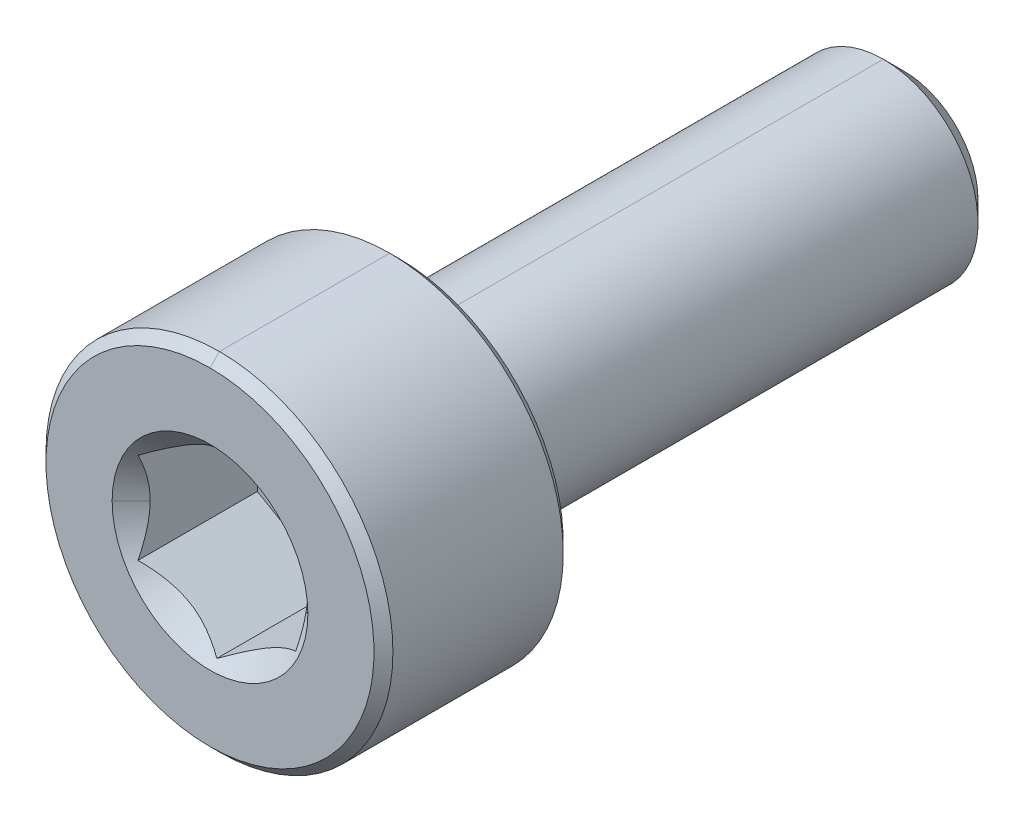
ISO-10303-21;
HEADER;
FILE_DESCRIPTION(('STEP AP214'),'2;1');
FILE_NAME('part.step','',(''),(''),'','','');
FILE_SCHEMA(('AUTOMOTIVE_DESIGN { 1 0 10303 214 1 1 1 1 }'));
ENDSEC;
DATA;
#1=APPLICATION_CONTEXT('core data for automotive mechanical design processes');
#2=APPLICATION_PROTOCOL_DEFINITION('international standard','automotive_design',2000,#1);
#3=PRODUCT_CONTEXT('',#1,'mechanical');
#4=PRODUCT('Part','Part','',(#3));
#5=PRODUCT_RELATED_PRODUCT_CATEGORY('part','',(#4));
#6=PRODUCT_DEFINITION_FORMATION('','',#4);
#7=PRODUCT_DEFINITION_CONTEXT('part definition',#1,'design');
#8=PRODUCT_DEFINITION('design','',#6,#7);
#9=PRODUCT_DEFINITION_SHAPE('','',#8);
#10=(LENGTH_UNIT() NAMED_UNIT(*) SI_UNIT(.MILLI.,.METRE.));
#11=(NAMED_UNIT(*) PLANE_ANGLE_UNIT() SI_UNIT($,.RADIAN.));
#12=(NAMED_UNIT(*) SI_UNIT($,.STERADIAN.) SOLID_ANGLE_UNIT());
#13=UNCERTAINTY_MEASURE_WITH_UNIT(LENGTH_MEASURE(1.E-05),#10,'distance_accuracy_value','');
#14=(GEOMETRIC_REPRESENTATION_CONTEXT(3) GLOBAL_UNCERTAINTY_ASSIGNED_CONTEXT((#13)) GLOBAL_UNIT_ASSIGNED_CONTEXT((#10,
#11,#12)) REPRESENTATION_CONTEXT('',''));
#15=CARTESIAN_POINT('',(0.,0.,0.));
#16=DIRECTION('',(0.,0.,1.));
#17=DIRECTION('',(1.,0.,0.));
#18=AXIS2_PLACEMENT_3D('',#15,#16,#17);
#19=CARTESIAN_POINT('',(1.25,-0.721687836487032,-1.31881307912986));
#20=DIRECTION('',(1.,0.,0.));
#21=DIRECTION('',(0.,-1.,0.));
#22=AXIS2_PLACEMENT_3D('',#19,#20,#21);
#23=PLANE('',#22);
#24=DIRECTION('',(0.,0.,1.));
#25=VECTOR('',#24,1.);
#26=CARTESIAN_POINT('',(1.25,-0.721687836487032,-1.31881307912986));
#27=LINE('',#26,#25);
#28=CARTESIAN_POINT('',(1.25,-0.721687836487033,3.5));
#29=VERTEX_POINT('',#28);
#30=CARTESIAN_POINT('',(1.25,-0.721687836487041,5.39174682452696));
#31=VERTEX_POINT('',#30);
#32=EDGE_CURVE('E279',#29,#31,#27,.T.);
#33=ORIENTED_EDGE('',*,*,#32,.T.);
#34=CARTESIAN_POINT('',(1.25,-0.721687836487032,5.39174682452701));
#35=CARTESIAN_POINT('',(1.25,-0.334936490538911,5.19837115155294));
#36=CARTESIAN_POINT('',(1.25,0.,5.19837115155294));
#37=B_SPLINE_CURVE_WITH_KNOTS('',2,(#34,#35,#36),.UNSPECIFIED.,.F.,.F.,(3,3),(0.,1.),.UNSPECIFIED.);
#38=CARTESIAN_POINT('',(1.25,0.,5.19837115155288));
#39=VERTEX_POINT('',#38);
#40=EDGE_CURVE('E349',#31,#39,#37,.T.);
#41=ORIENTED_EDGE('',*,*,#40,.T.);
#42=CARTESIAN_POINT('',(1.25,0.,5.19837115155294));
#43=CARTESIAN_POINT('',(1.25,0.180809106046867,5.19837115155294));
#44=CARTESIAN_POINT('',(1.25,0.371449563482307,5.25239368901573));
#45=CARTESIAN_POINT('',(1.25,0.53655435705269,5.29918008480984));
#46=CARTESIAN_POINT('',(1.25,0.721687836487038,5.39174682452701));
#47=B_SPLINE_CURVE_WITH_KNOTS('',2,(#42,#43,#44,#45,#46),.UNSPECIFIED.,.F.,.F.,(3,2,3),(0.,0.5,
1.),.UNSPECIFIED.);
#48=CARTESIAN_POINT('',(1.25,0.721687836487031,5.39174682452696));
#49=VERTEX_POINT('',#48);
#50=EDGE_CURVE('E360',#39,#49,#47,.T.);
#51=ORIENTED_EDGE('',*,*,#50,.T.);
#52=DIRECTION('',(0.,0.,1.));
#53=VECTOR('',#52,1.);
#54=CARTESIAN_POINT('',(1.25,0.721687836487015,-1.31881307912986));
#55=LINE('',#54,#53);
#56=CARTESIAN_POINT('',(1.25,0.721687836487031,3.5));
#57=VERTEX_POINT('',#56);
#58=EDGE_CURVE('E11',#57,#49,#55,.T.);
#59=ORIENTED_EDGE('',*,*,#58,.F.);
#60=DIRECTION('',(0.,1.,0.));
#61=VECTOR('',#60,1.);
#62=CARTESIAN_POINT('',(1.25,-0.721687836487033,3.5));
#63=LINE('',#62,#61);
#64=EDGE_CURVE('E353',#29,#57,#63,.T.);
#65=ORIENTED_EDGE('',*,*,#64,.F.);
#66=EDGE_LOOP('',(#33,#41,#51,#59,#65));
#67=FACE_BOUND('',#66,.T.);
#68=ADVANCED_FACE('F16',(#67),#23,.F.);
#69=CARTESIAN_POINT('',(1.25,0.721687836487015,-1.31881307912986));
#70=DIRECTION('',(0.500000000000002,0.866025403784443,0.));
#71=DIRECTION('',(0.,0.,-1.));
#72=AXIS2_PLACEMENT_3D('',#69,#70,#71);
#73=PLANE('',#72);
#74=ORIENTED_EDGE('',*,*,#58,.T.);
#75=CARTESIAN_POINT('',(1.25,0.721687836487015,5.39174682452695));
#76=CARTESIAN_POINT('',(0.916560687279556,0.914199113444568,5.1992355475694));
#77=CARTESIAN_POINT('',(0.627302735621752,1.08120226969944,5.19837397959837));
#78=CARTESIAN_POINT('',(0.336432191072367,1.24913645689436,5.19750760844604));
#79=CARTESIAN_POINT('',(0.,1.44337567297405,5.39174682452695));
#80=B_SPLINE_CURVE_WITH_KNOTS('',2,(#75,#76,#77,#78,#79),.UNSPECIFIED.,.F.,.F.,(3,2,3),(0.,0.5,
1.),.UNSPECIFIED.);
#81=CARTESIAN_POINT('',(0.,1.44337567297406,5.39174682452695));
#82=VERTEX_POINT('',#81);
#83=EDGE_CURVE('E368',#49,#82,#80,.T.);
#84=ORIENTED_EDGE('',*,*,#83,.T.);
#85=DIRECTION('',(0.,0.,1.));
#86=VECTOR('',#85,1.);
#87=CARTESIAN_POINT('',(0.,1.44337567297405,-1.31881307912986));
#88=LINE('',#87,#86);
#89=CARTESIAN_POINT('',(0.,1.44337567297406,3.5));
#90=VERTEX_POINT('',#89);
#91=EDGE_CURVE('E28',#90,#82,#88,.T.);
#92=ORIENTED_EDGE('',*,*,#91,.F.);
#93=DIRECTION('',(-0.866025403784443,0.500000000000002,0.));
#94=VECTOR('',#93,1.);
#95=CARTESIAN_POINT('',(1.25,0.721687836487031,3.5));
#96=LINE('',#95,#94);
#97=EDGE_CURVE('E366',#57,#90,#96,.T.);
#98=ORIENTED_EDGE('',*,*,#97,.F.);
#99=EDGE_LOOP('',(#74,#84,#92,#98));
#100=FACE_BOUND('',#99,.T.);
#101=ADVANCED_FACE('F340',(#100),#73,.F.);
#102=CARTESIAN_POINT('',(0.,1.44337567297405,-1.31881307912986));
#103=DIRECTION('',(-0.500000000000002,0.866025403784443,0.));
#104=DIRECTION('',(0.,0.,1.));
#105=AXIS2_PLACEMENT_3D('',#102,#103,#104);
#106=PLANE('',#105);
#107=ORIENTED_EDGE('',*,*,#91,.T.);
#108=CARTESIAN_POINT('',(0.,1.44337567297405,5.39174682452695));
#109=CARTESIAN_POINT('',(-0.333439312721849,1.25086439601568,5.19923554756859));
#110=CARTESIAN_POINT('',(-0.622697264378248,1.08386123976162,5.19837397959837));
#111=CARTESIAN_POINT('',(-0.91356780892904,0.915927052565889,5.19750760844685));
#112=CARTESIAN_POINT('',(-1.25000000000001,0.721687836487011,5.39174682452695));
#113=B_SPLINE_CURVE_WITH_KNOTS('',2,(#108,#109,#110,#111,#112),.UNSPECIFIED.,.F.,.F.,(3,2,3),
(0.,0.5,1.),.UNSPECIFIED.);
#114=CARTESIAN_POINT('',(-1.24999999999999,0.721687836487031,5.39174682452695));
#115=VERTEX_POINT('',#114);
#116=EDGE_CURVE('E184',#82,#115,#113,.T.);
#117=ORIENTED_EDGE('',*,*,#116,.T.);
#118=DIRECTION('',(0.,0.,1.));
#119=VECTOR('',#118,1.);
#120=CARTESIAN_POINT('',(-1.25,0.721687836487015,-1.31881307912987));
#121=LINE('',#120,#119);
#122=CARTESIAN_POINT('',(-1.25,0.721687836487031,3.5));
#123=VERTEX_POINT('',#122);
#124=EDGE_CURVE('E53',#123,#115,#121,.T.);
#125=ORIENTED_EDGE('',*,*,#124,.F.);
#126=DIRECTION('',(-0.866025403784444,-0.500000000000002,0.));
#127=VECTOR('',#126,1.);
#128=CARTESIAN_POINT('',(0.,1.44337567297406,3.5));
#129=LINE('',#128,#127);
#130=EDGE_CURVE('E375',#90,#123,#129,.T.);
#131=ORIENTED_EDGE('',*,*,#130,.F.);
#132=EDGE_LOOP('',(#107,#117,#125,#131));
#133=FACE_BOUND('',#132,.T.);
#134=ADVANCED_FACE('F220',(#133),#106,.F.);
#135=CARTESIAN_POINT('',(-1.25,0.721687836487015,-1.31881307912987));
#136=DIRECTION('',(-1.,0.,0.));
#137=DIRECTION('',(0.,1.,0.));
#138=AXIS2_PLACEMENT_3D('',#135,#136,#137);
#139=PLANE('',#138);
#140=ORIENTED_EDGE('',*,*,#124,.T.);
#141=CARTESIAN_POINT('',(-1.25,0.721687836487015,5.391746824527));
#142=CARTESIAN_POINT('',(-1.25,0.538824359635435,5.30031508610121));
#143=CARTESIAN_POINT('',(-1.25,0.371449563482285,5.25239368901573));
#144=CARTESIAN_POINT('',(-1.25,0.182765348383507,5.19837115155294));
#145=CARTESIAN_POINT('',(-1.25,0.,5.19837115155294));
#146=B_SPLINE_CURVE_WITH_KNOTS('',2,(#141,#142,#143,#144,#145),.UNSPECIFIED.,.F.,.F.,(3,2,3),
(0.,0.5,1.),.UNSPECIFIED.);
#147=CARTESIAN_POINT('',(-1.25,0.,5.19837115155287));
#148=VERTEX_POINT('',#147);
#149=EDGE_CURVE('E173',#115,#148,#146,.T.);
#150=ORIENTED_EDGE('',*,*,#149,.T.);
#151=CARTESIAN_POINT('',(-1.25,0.,5.19837115155294));
#152=CARTESIAN_POINT('',(-1.25,-0.334936490538933,5.19837115155294));
#153=CARTESIAN_POINT('',(-1.25,-0.721687836487055,5.391746824527));
#154=B_SPLINE_CURVE_WITH_KNOTS('',2,(#151,#152,#153),.UNSPECIFIED.,.F.,.F.,(3,3),(0.,1.),.UNSPECIFIED.);
#155=CARTESIAN_POINT('',(-1.24999999999999,-0.721687836487033,5.39174682452695));
#156=VERTEX_POINT('',#155);
#157=EDGE_CURVE('E178',#148,#156,#154,.T.);
#158=ORIENTED_EDGE('',*,*,#157,.T.);
#159=DIRECTION('',(0.,0.,1.));
#160=VECTOR('',#159,1.);
#161=CARTESIAN_POINT('',(-1.25,-0.721687836487032,-1.31881307912987));
#162=LINE('',#161,#160);
#163=CARTESIAN_POINT('',(-1.25,-0.721687836487033,3.5));
#164=VERTEX_POINT('',#163);
#165=EDGE_CURVE('E42',#164,#156,#162,.T.);
#166=ORIENTED_EDGE('',*,*,#165,.F.);
#167=DIRECTION('',(0.,-1.,0.));
#168=VECTOR('',#167,1.);
#169=CARTESIAN_POINT('',(-1.25,0.721687836487031,3.5));
#170=LINE('',#169,#168);
#171=EDGE_CURVE('E379',#123,#164,#170,.T.);
#172=ORIENTED_EDGE('',*,*,#171,.F.);
#173=EDGE_LOOP('',(#140,#150,#158,#166,#172));
#174=FACE_BOUND('',#173,.T.);
#175=ADVANCED_FACE('F176',(#174),#139,.F.);
#176=CARTESIAN_POINT('',(-1.25,-0.721687836487032,-1.31881307912987));
#177=DIRECTION('',(-0.500000000000002,-0.866025403784443,0.));
#178=DIRECTION('',(-0.866025403784443,0.500000000000002,0.));
#179=AXIS2_PLACEMENT_3D('',#176,#177,#178);
#180=PLANE('',#179);
#181=ORIENTED_EDGE('',*,*,#165,.T.);
#182=CARTESIAN_POINT('',(-1.25,-0.721687836487032,5.39174682452701));
#183=CARTESIAN_POINT('',(-0.916560687278618,-0.914199113445126,5.19923554756892));
#184=CARTESIAN_POINT('',(-0.627302735621752,-1.08120226969946,5.19837397959843));
#185=CARTESIAN_POINT('',(-0.33643219107143,-1.24913645689492,5.19750760844664));
#186=CARTESIAN_POINT('',(0.,-1.44337567297407,5.39174682452701));
#187=B_SPLINE_CURVE_WITH_KNOTS('',2,(#182,#183,#184,#185,#186),.UNSPECIFIED.,.F.,.F.,(3,2,3),
(0.,0.5,1.),.UNSPECIFIED.);
#188=CARTESIAN_POINT('',(0.,-1.44337567297407,5.39174682452695));
#189=VERTEX_POINT('',#188);
#190=EDGE_CURVE('E202',#156,#189,#187,.T.);
#191=ORIENTED_EDGE('',*,*,#190,.T.);
#192=DIRECTION('',(0.,0.,1.));
#193=VECTOR('',#192,1.);
#194=CARTESIAN_POINT('',(0.,-1.44337567297406,-1.31881307912986));
#195=LINE('',#194,#193);
#196=CARTESIAN_POINT('',(0.,-1.44337567297406,3.5));
#197=VERTEX_POINT('',#196);
#198=EDGE_CURVE('E285',#197,#189,#195,.T.);
#199=ORIENTED_EDGE('',*,*,#198,.F.);
#200=DIRECTION('',(0.866025403784443,-0.500000000000002,0.));
#201=VECTOR('',#200,1.);
#202=CARTESIAN_POINT('',(-1.25,-0.721687836487032,3.5));
#203=LINE('',#202,#201);
#204=EDGE_CURVE('E295',#164,#197,#203,.T.);
#205=ORIENTED_EDGE('',*,*,#204,.F.);
#206=EDGE_LOOP('',(#181,#191,#199,#205));
#207=FACE_BOUND('',#206,.T.);
#208=ADVANCED_FACE('F219',(#207),#180,.F.);
#209=CARTESIAN_POINT('',(0.,-1.44337567297406,-1.31881307912986));
#210=DIRECTION('',(0.500000000000002,-0.866025403784443,0.));
#211=DIRECTION('',(0.,0.,-1.));
#212=AXIS2_PLACEMENT_3D('',#209,#210,#211);
#213=PLANE('',#212);
#214=ORIENTED_EDGE('',*,*,#198,.T.);
#215=CARTESIAN_POINT('',(0.,-1.44337567297406,5.39174682452695));
#216=CARTESIAN_POINT('',(0.333439312721382,-1.25086439601597,5.19923554756886));
#217=CARTESIAN_POINT('',(0.622697264378248,-1.08386123976164,5.19837397959837));
#218=CARTESIAN_POINT('',(0.913567808928573,-0.915927052566176,5.19750760844658));
#219=CARTESIAN_POINT('',(1.25000000000001,-0.721687836487029,5.39174682452695));
#220=B_SPLINE_CURVE_WITH_KNOTS('',2,(#215,#216,#217,#218,#219),.UNSPECIFIED.,.F.,.F.,(3,2,3),
(0.,0.5,1.),.UNSPECIFIED.);
#221=EDGE_CURVE('E301',#189,#31,#220,.T.);
#222=ORIENTED_EDGE('',*,*,#221,.T.);
#223=ORIENTED_EDGE('',*,*,#32,.F.);
#224=DIRECTION('',(0.866025403784443,0.500000000000002,0.));
#225=VECTOR('',#224,1.);
#226=CARTESIAN_POINT('',(0.,-1.44337567297406,3.5));
#227=LINE('',#226,#225);
#228=EDGE_CURVE('E356',#197,#29,#227,.T.);
#229=ORIENTED_EDGE('',*,*,#228,.F.);
#230=EDGE_LOOP('',(#214,#222,#223,#229));
#231=FACE_BOUND('',#230,.T.);
#232=ADVANCED_FACE('F308',(#231),#213,.F.);
#233=CARTESIAN_POINT('',(0.,2.6,3.5));
#234=DIRECTION('',(0.,0.,-1.));
#235=DIRECTION('',(-1.,0.,0.));
#236=AXIS2_PLACEMENT_3D('',#233,#234,#235);
#237=PLANE('',#236);
#238=ORIENTED_EDGE('',*,*,#228,.T.);
#239=ORIENTED_EDGE('',*,*,#64,.T.);
#240=ORIENTED_EDGE('',*,*,#97,.T.);
#241=ORIENTED_EDGE('',*,*,#130,.T.);
#242=ORIENTED_EDGE('',*,*,#171,.T.);
#243=ORIENTED_EDGE('',*,*,#204,.T.);
#244=EDGE_LOOP('',(#238,#239,#240,#241,#242,#243));
#245=FACE_BOUND('',#244,.T.);
#246=ADVANCED_FACE('F246',(#245),#237,.F.);
#247=CARTESIAN_POINT('',(0.,0.,5.5));
#248=DIRECTION('',(0.,0.,1.));
#249=DIRECTION('',(1.,0.,0.));
#250=AXIS2_PLACEMENT_3D('',#247,#248,#249);
#251=CONICAL_SURFACE('',#250,1.55162884844712,0.78539816339745);
#252=DIRECTION('',(-0.707106781186551,0.,0.707106781186546));
#253=VECTOR('',#252,1.);
#254=CARTESIAN_POINT('',(-1.55162884844712,0.,5.5));
#255=LINE('',#254,#253);
#256=CARTESIAN_POINT('',(-1.55162884844712,0.,5.5));
#257=VERTEX_POINT('',#256);
#258=EDGE_CURVE('E189',#148,#257,#255,.T.);
#259=ORIENTED_EDGE('',*,*,#258,.F.);
#260=ORIENTED_EDGE('',*,*,#149,.F.);
#261=ORIENTED_EDGE('',*,*,#116,.F.);
#262=ORIENTED_EDGE('',*,*,#83,.F.);
#263=ORIENTED_EDGE('',*,*,#50,.F.);
#264=DIRECTION('',(0.707106781186551,0.,0.707106781186546));
#265=VECTOR('',#264,1.);
#266=CARTESIAN_POINT('',(1.55162884844713,0.,5.5));
#267=LINE('',#266,#265);
#268=CARTESIAN_POINT('',(1.55162884844713,0.,5.5));
#269=VERTEX_POINT('',#268);
#270=EDGE_CURVE('E394',#39,#269,#267,.T.);
#271=ORIENTED_EDGE('',*,*,#270,.T.);
#272=CARTESIAN_POINT('',(0.,0.,5.5));
#273=DIRECTION('',(0.,0.,1.));
#274=DIRECTION('',(1.,0.,0.));
#275=AXIS2_PLACEMENT_3D('',#272,#273,#274);
#276=CIRCLE('',#275,1.55162884844712);
#277=EDGE_CURVE('E185',#269,#257,#276,.T.);
#278=ORIENTED_EDGE('',*,*,#277,.T.);
#279=EDGE_LOOP('',(#259,#260,#261,#262,#263,#271,#278));
#280=FACE_BOUND('',#279,.T.);
#281=ADVANCED_FACE('F190',(#280),#251,.F.);
#282=CARTESIAN_POINT('',(0.,0.,5.5));
#283=DIRECTION('',(0.,0.,1.));
#284=DIRECTION('',(0.,-1.,0.));
#285=AXIS2_PLACEMENT_3D('',#282,#283,#284);
#286=PLANE('',#285);
#287=ORIENTED_EDGE('',*,*,#277,.F.);
#288=CARTESIAN_POINT('',(0.,0.,5.5));
#289=DIRECTION('',(0.,0.,1.));
#290=DIRECTION('',(1.,0.,0.));
#291=AXIS2_PLACEMENT_3D('',#288,#289,#290);
#292=CIRCLE('',#291,1.55162884844712);
#293=EDGE_CURVE('E196',#257,#269,#292,.T.);
#294=ORIENTED_EDGE('',*,*,#293,.F.);
#295=EDGE_LOOP('',(#287,#294));
#296=FACE_BOUND('',#295,.T.);
#297=CARTESIAN_POINT('',(0.,0.,5.5));
#298=DIRECTION('',(0.,0.,-1.));
#299=DIRECTION('',(0.,1.,0.));
#300=AXIS2_PLACEMENT_3D('',#297,#298,#299);
#301=CIRCLE('',#300,2.6);
#302=CARTESIAN_POINT('',(0.,2.6,5.5));
#303=VERTEX_POINT('',#302);
#304=CARTESIAN_POINT('',(0.,-2.60000000000002,5.5));
#305=VERTEX_POINT('',#304);
#306=EDGE_CURVE('E442',#303,#305,#301,.T.);
#307=ORIENTED_EDGE('',*,*,#306,.F.);
#308=CARTESIAN_POINT('',(0.,0.,5.5));
#309=DIRECTION('',(0.,0.,-1.));
#310=DIRECTION('',(0.,1.,0.));
#311=AXIS2_PLACEMENT_3D('',#308,#309,#310);
#312=CIRCLE('',#311,2.6);
#313=EDGE_CURVE('E430',#305,#303,#312,.T.);
#314=ORIENTED_EDGE('',*,*,#313,.F.);
#315=EDGE_LOOP('',(#307,#314));
#316=FACE_BOUND('',#315,.T.);
#317=ADVANCED_FACE('F245',(#296,#316),#286,.T.);
#318=CARTESIAN_POINT('',(0.,0.,5.35));
#319=DIRECTION('',(0.,0.,-1.));
#320=DIRECTION('',(0.,1.,0.));
#321=AXIS2_PLACEMENT_3D('',#318,#319,#320);
#322=CONICAL_SURFACE('',#321,2.75,0.785398163397451);
#323=DIRECTION('',(0.,-0.707106781186552,-0.707106781186546));
#324=VECTOR('',#323,1.);
#325=CARTESIAN_POINT('',(0.,-2.75000000000002,5.35));
#326=LINE('',#325,#324);
#327=CARTESIAN_POINT('',(0.,-2.75000000000002,5.35));
#328=VERTEX_POINT('',#327);
#329=EDGE_CURVE('E446',#305,#328,#326,.T.);
#330=ORIENTED_EDGE('',*,*,#329,.F.);
#331=ORIENTED_EDGE('',*,*,#313,.T.);
#332=DIRECTION('',(0.,0.707106781186552,-0.707106781186546));
#333=VECTOR('',#332,1.);
#334=CARTESIAN_POINT('',(0.,2.75,5.35));
#335=LINE('',#334,#333);
#336=CARTESIAN_POINT('',(0.,2.75,5.35));
#337=VERTEX_POINT('',#336);
#338=EDGE_CURVE('E451',#303,#337,#335,.T.);
#339=ORIENTED_EDGE('',*,*,#338,.T.);
#340=CARTESIAN_POINT('',(0.,0.,5.35));
#341=DIRECTION('',(0.,0.,-1.));
#342=DIRECTION('',(0.,1.,0.));
#343=AXIS2_PLACEMENT_3D('',#340,#341,#342);
#344=CIRCLE('',#343,2.75);
#345=EDGE_CURVE('E426',#328,#337,#344,.T.);
#346=ORIENTED_EDGE('',*,*,#345,.F.);
#347=EDGE_LOOP('',(#330,#331,#339,#346));
#348=FACE_BOUND('',#347,.T.);
#349=ADVANCED_FACE('F320',(#348),#322,.T.);
#350=CARTESIAN_POINT('',(1.38777878078145E-13,0.,-5.5));
#351=DIRECTION('',(0.,0.,-1.));
#352=DIRECTION('',(0.,1.,0.));
#353=AXIS2_PLACEMENT_3D('',#350,#351,#352);
#354=CYLINDRICAL_SURFACE('',#353,2.75);
#355=DIRECTION('',(0.,0.,-1.));
#356=VECTOR('',#355,1.);
#357=CARTESIAN_POINT('',(1.38777878078145E-13,-2.75000000000002,-5.5));
#358=LINE('',#357,#356);
#359=CARTESIAN_POINT('',(0.,-2.75000000000002,2.65));
#360=VERTEX_POINT('',#359);
#361=EDGE_CURVE('E421',#328,#360,#358,.T.);
#362=ORIENTED_EDGE('',*,*,#361,.F.);
#363=ORIENTED_EDGE('',*,*,#345,.T.);
#364=DIRECTION('',(0.,0.,-1.));
#365=VECTOR('',#364,1.);
#366=CARTESIAN_POINT('',(1.38777878078145E-13,2.75,-5.5));
#367=LINE('',#366,#365);
#368=CARTESIAN_POINT('',(0.,2.74999999999998,2.65));
#369=VERTEX_POINT('',#368);
#370=EDGE_CURVE('E441',#337,#369,#367,.T.);
#371=ORIENTED_EDGE('',*,*,#370,.T.);
#372=CARTESIAN_POINT('',(0.,0.,2.65));
#373=DIRECTION('',(0.,0.,-1.));
#374=DIRECTION('',(0.,1.,0.));
#375=AXIS2_PLACEMENT_3D('',#372,#373,#374);
#376=CIRCLE('',#375,2.75);
#377=EDGE_CURVE('E423',#360,#369,#376,.T.);
#378=ORIENTED_EDGE('',*,*,#377,.F.);
#379=EDGE_LOOP('',(#362,#363,#371,#378));
#380=FACE_BOUND('',#379,.T.);
#381=ADVANCED_FACE('F323',(#380),#354,.T.);
#382=CARTESIAN_POINT('',(0.,0.,2.5));
#383=DIRECTION('',(0.,0.,1.));
#384=DIRECTION('',(0.,-1.,0.));
#385=AXIS2_PLACEMENT_3D('',#382,#383,#384);
#386=CONICAL_SURFACE('',#385,2.6,0.785398163397446);
#387=DIRECTION('',(0.,0.707106781186548,0.70710678118655));
#388=VECTOR('',#387,1.);
#389=CARTESIAN_POINT('',(0.,2.59999999999998,2.5));
#390=LINE('',#389,#388);
#391=CARTESIAN_POINT('',(0.,2.59999999999998,2.5));
#392=VERTEX_POINT('',#391);
#393=EDGE_CURVE('E431',#392,#369,#390,.T.);
#394=ORIENTED_EDGE('',*,*,#393,.F.);
#395=CARTESIAN_POINT('',(0.,0.,2.5));
#396=DIRECTION('',(0.,0.,-1.));
#397=DIRECTION('',(0.,1.,0.));
#398=AXIS2_PLACEMENT_3D('',#395,#396,#397);
#399=CIRCLE('',#398,2.6);
#400=CARTESIAN_POINT('',(0.,-2.60000000000002,2.5));
#401=VERTEX_POINT('',#400);
#402=EDGE_CURVE('E427',#401,#392,#399,.T.);
#403=ORIENTED_EDGE('',*,*,#402,.F.);
#404=DIRECTION('',(0.,-0.707106781186548,0.70710678118655));
#405=VECTOR('',#404,1.);
#406=CARTESIAN_POINT('',(0.,-2.60000000000002,2.5));
#407=LINE('',#406,#405);
#408=EDGE_CURVE('E435',#401,#360,#407,.T.);
#409=ORIENTED_EDGE('',*,*,#408,.T.);
#410=ORIENTED_EDGE('',*,*,#377,.T.);
#411=EDGE_LOOP('',(#394,#403,#409,#410));
#412=FACE_BOUND('',#411,.T.);
#413=ADVANCED_FACE('F328',(#412),#386,.T.);
#414=CARTESIAN_POINT('',(0.,2.59999999999998,2.5));
#415=DIRECTION('',(0.,0.,-1.));
#416=DIRECTION('',(-1.,0.,0.));
#417=AXIS2_PLACEMENT_3D('',#414,#415,#416);
#418=PLANE('',#417);
#419=CARTESIAN_POINT('',(0.,0.,2.5));
#420=DIRECTION('',(0.,0.,-1.));
#421=DIRECTION('',(0.,1.,0.));
#422=AXIS2_PLACEMENT_3D('',#419,#420,#421);
#423=CIRCLE('',#422,1.65);
#424=CARTESIAN_POINT('',(0.,1.64999999999998,2.5));
#425=VERTEX_POINT('',#424);
#426=CARTESIAN_POINT('',(0.,-1.65000000000002,2.5));
#427=VERTEX_POINT('',#426);
#428=EDGE_CURVE('E511',#425,#427,#423,.T.);
#429=ORIENTED_EDGE('',*,*,#428,.F.);
#430=CARTESIAN_POINT('',(0.,0.,2.5));
#431=DIRECTION('',(0.,0.,-1.));
#432=DIRECTION('',(0.,1.,0.));
#433=AXIS2_PLACEMENT_3D('',#430,#431,#432);
#434=CIRCLE('',#433,1.65);
#435=EDGE_CURVE('E474',#427,#425,#434,.T.);
#436=ORIENTED_EDGE('',*,*,#435,.F.);
#437=EDGE_LOOP('',(#429,#436));
#438=FACE_BOUND('',#437,.T.);
#439=ORIENTED_EDGE('',*,*,#402,.T.);
#440=CARTESIAN_POINT('',(0.,0.,2.5));
#441=DIRECTION('',(0.,0.,-1.));
#442=DIRECTION('',(0.,1.,0.));
#443=AXIS2_PLACEMENT_3D('',#440,#441,#442);
#444=CIRCLE('',#443,2.6);
#445=EDGE_CURVE('E436',#392,#401,#444,.T.);
#446=ORIENTED_EDGE('',*,*,#445,.T.);
#447=EDGE_LOOP('',(#439,#446));
#448=FACE_BOUND('',#447,.T.);
#449=ADVANCED_FACE('F325',(#438,#448),#418,.T.);
#450=CARTESIAN_POINT('',(0.,0.,2.35));
#451=DIRECTION('',(0.,0.,-1.));
#452=DIRECTION('',(0.,1.,0.));
#453=AXIS2_PLACEMENT_3D('',#450,#451,#452);
#454=TOROIDAL_SURFACE('',#453,1.65,0.15);
#455=CARTESIAN_POINT('',(0.,-1.65000000000002,2.35));
#456=DIRECTION('',(1.,0.,0.));
#457=DIRECTION('',(0.,1.,0.));
#458=AXIS2_PLACEMENT_3D('',#455,#456,#457);
#459=CIRCLE('',#458,0.15);
#460=CARTESIAN_POINT('',(0.,-1.50000000000002,2.35));
#461=VERTEX_POINT('',#460);
#462=EDGE_CURVE('E470',#461,#427,#459,.T.);
#463=ORIENTED_EDGE('',*,*,#462,.F.);
#464=CARTESIAN_POINT('',(0.,0.,2.35));
#465=DIRECTION('',(0.,0.,-1.));
#466=DIRECTION('',(0.,1.,0.));
#467=AXIS2_PLACEMENT_3D('',#464,#465,#466);
#468=CIRCLE('',#467,1.5);
#469=CARTESIAN_POINT('',(0.,1.49999999999998,2.35));
#470=VERTEX_POINT('',#469);
#471=EDGE_CURVE('E482',#470,#461,#468,.T.);
#472=ORIENTED_EDGE('',*,*,#471,.F.);
#473=CARTESIAN_POINT('',(0.,1.64999999999998,2.35));
#474=DIRECTION('',(-1.,0.,0.));
#475=DIRECTION('',(0.,0.,1.));
#476=AXIS2_PLACEMENT_3D('',#473,#474,#475);
#477=CIRCLE('',#476,0.15);
#478=EDGE_CURVE('E478',#470,#425,#477,.T.);
#479=ORIENTED_EDGE('',*,*,#478,.T.);
#480=ORIENTED_EDGE('',*,*,#428,.T.);
#481=EDGE_LOOP('',(#463,#472,#479,#480));
#482=FACE_BOUND('',#481,.T.);
#483=ADVANCED_FACE('F327',(#482),#454,.F.);
#484=CARTESIAN_POINT('',(1.38777878078145E-13,0.,-5.5));
#485=DIRECTION('',(0.,0.,-1.));
#486=DIRECTION('',(0.,1.,0.));
#487=AXIS2_PLACEMENT_3D('',#484,#485,#486);
#488=CYLINDRICAL_SURFACE('',#487,1.5);
#489=DIRECTION('',(0.,0.,-1.));
#490=VECTOR('',#489,1.);
#491=CARTESIAN_POINT('',(1.38777878078145E-13,-1.50000000000002,-5.5));
#492=LINE('',#491,#490);
#493=CARTESIAN_POINT('',(1.38777878078145E-13,-1.50000000000002,-5.17524047358083));
#494=VERTEX_POINT('',#493);
#495=EDGE_CURVE('E486',#461,#494,#492,.T.);
#496=ORIENTED_EDGE('',*,*,#495,.F.);
#497=CARTESIAN_POINT('',(0.,0.,2.35));
#498=DIRECTION('',(0.,0.,-1.));
#499=DIRECTION('',(0.,1.,0.));
#500=AXIS2_PLACEMENT_3D('',#497,#498,#499);
#501=CIRCLE('',#500,1.5);
#502=EDGE_CURVE('E466',#461,#470,#501,.T.);
#503=ORIENTED_EDGE('',*,*,#502,.T.);
#504=DIRECTION('',(0.,0.,-1.));
#505=VECTOR('',#504,1.);
#506=CARTESIAN_POINT('',(1.38777878078145E-13,1.5,-5.5));
#507=LINE('',#506,#505);
#508=CARTESIAN_POINT('',(0.,1.5,-5.17524047358083));
#509=VERTEX_POINT('',#508);
#510=EDGE_CURVE('E494',#470,#509,#507,.T.);
#511=ORIENTED_EDGE('',*,*,#510,.T.);
#512=CARTESIAN_POINT('',(0.,0.,-5.17524047358083));
#513=DIRECTION('',(0.,0.,-1.));
#514=DIRECTION('',(0.,1.,0.));
#515=AXIS2_PLACEMENT_3D('',#512,#513,#514);
#516=CIRCLE('',#515,1.5);
#517=EDGE_CURVE('E455',#494,#509,#516,.T.);
#518=ORIENTED_EDGE('',*,*,#517,.F.);
#519=EDGE_LOOP('',(#496,#503,#511,#518));
#520=FACE_BOUND('',#519,.T.);
#521=ADVANCED_FACE('F621',(#520),#488,.T.);
#522=CARTESIAN_POINT('',(1.38777878078145E-13,0.,-5.5));
#523=DIRECTION('',(0.,0.,1.));
#524=DIRECTION('',(0.,-1.,0.));
#525=AXIS2_PLACEMENT_3D('',#522,#523,#524);
#526=CONICAL_SURFACE('',#525,1.17524047358084,0.785398163397445);
#527=DIRECTION('',(0.,0.707106781186547,0.70710678118655));
#528=VECTOR('',#527,1.);
#529=CARTESIAN_POINT('',(1.38777878078145E-13,1.17524047358082,-5.5));
#530=LINE('',#529,#528);
#531=CARTESIAN_POINT('',(1.38777878078145E-13,1.17524047358082,-5.5));
#532=VERTEX_POINT('',#531);
#533=EDGE_CURVE('E502',#532,#509,#530,.T.);
#534=ORIENTED_EDGE('',*,*,#533,.F.);
#535=CARTESIAN_POINT('',(1.38777878078145E-13,0.,-5.5));
#536=DIRECTION('',(0.,0.,-1.));
#537=DIRECTION('',(0.,1.,0.));
#538=AXIS2_PLACEMENT_3D('',#535,#536,#537);
#539=CIRCLE('',#538,1.17524047358084);
#540=CARTESIAN_POINT('',(1.38777878078145E-13,-1.17524047358084,-5.5));
#541=VERTEX_POINT('',#540);
#542=EDGE_CURVE('E452',#541,#532,#539,.T.);
#543=ORIENTED_EDGE('',*,*,#542,.F.);
#544=DIRECTION('',(0.,-0.707106781186547,0.70710678118655));
#545=VECTOR('',#544,1.);
#546=CARTESIAN_POINT('',(1.38777878078145E-13,-1.17524047358084,-5.5));
#547=LINE('',#546,#545);
#548=EDGE_CURVE('E456',#541,#494,#547,.T.);
#549=ORIENTED_EDGE('',*,*,#548,.T.);
#550=ORIENTED_EDGE('',*,*,#517,.T.);
#551=EDGE_LOOP('',(#534,#543,#549,#550));
#552=FACE_BOUND('',#551,.T.);
#553=ADVANCED_FACE('F318',(#552),#526,.T.);
#554=CARTESIAN_POINT('',(1.38777878078145E-13,1.17524047358082,-5.5));
#555=DIRECTION('',(0.,0.,-1.));
#556=DIRECTION('',(-1.,0.,0.));
#557=AXIS2_PLACEMENT_3D('',#554,#555,#556);
#558=PLANE('',#557);
#559=ORIENTED_EDGE('',*,*,#542,.T.);
#560=CARTESIAN_POINT('',(1.38777878078145E-13,0.,-5.5));
#561=DIRECTION('',(0.,0.,-1.));
#562=DIRECTION('',(0.,1.,0.));
#563=AXIS2_PLACEMENT_3D('',#560,#561,#562);
#564=CIRCLE('',#563,1.17524047358084);
#565=EDGE_CURVE('E498',#532,#541,#564,.T.);
#566=ORIENTED_EDGE('',*,*,#565,.T.);
#567=EDGE_LOOP('',(#559,#566));
#568=FACE_BOUND('',#567,.T.);
#569=ADVANCED_FACE('F695',(#568),#558,.T.);
#570=CARTESIAN_POINT('',(1.38777878078145E-13,0.,-5.5));
#571=DIRECTION('',(0.,0.,1.));
#572=DIRECTION('',(0.,-1.,0.));
#573=AXIS2_PLACEMENT_3D('',#570,#571,#572);
#574=CONICAL_SURFACE('',#573,1.17524047358084,0.785398163397445);
#575=ORIENTED_EDGE('',*,*,#565,.F.);
#576=ORIENTED_EDGE('',*,*,#533,.T.);
#577=CARTESIAN_POINT('',(0.,0.,-5.17524047358083));
#578=DIRECTION('',(0.,0.,-1.));
#579=DIRECTION('',(0.,1.,0.));
#580=AXIS2_PLACEMENT_3D('',#577,#578,#579);
#581=CIRCLE('',#580,1.5);
#582=EDGE_CURVE('E490',#509,#494,#581,.T.);
#583=ORIENTED_EDGE('',*,*,#582,.T.);
#584=ORIENTED_EDGE('',*,*,#548,.F.);
#585=EDGE_LOOP('',(#575,#576,#583,#584));
#586=FACE_BOUND('',#585,.T.);
#587=ADVANCED_FACE('F686',(#586),#574,.T.);
#588=CARTESIAN_POINT('',(1.38777878078145E-13,0.,-5.5));
#589=DIRECTION('',(0.,0.,-1.));
#590=DIRECTION('',(0.,1.,0.));
#591=AXIS2_PLACEMENT_3D('',#588,#589,#590);
#592=CYLINDRICAL_SURFACE('',#591,1.5);
#593=ORIENTED_EDGE('',*,*,#471,.T.);
#594=ORIENTED_EDGE('',*,*,#495,.T.);
#595=ORIENTED_EDGE('',*,*,#582,.F.);
#596=ORIENTED_EDGE('',*,*,#510,.F.);
#597=EDGE_LOOP('',(#593,#594,#595,#596));
#598=FACE_BOUND('',#597,.T.);
#599=ADVANCED_FACE('F677',(#598),#592,.T.);
#600=CARTESIAN_POINT('',(0.,0.,2.35));
#601=DIRECTION('',(0.,0.,-1.));
#602=DIRECTION('',(0.,1.,0.));
#603=AXIS2_PLACEMENT_3D('',#600,#601,#602);
#604=TOROIDAL_SURFACE('',#603,1.65,0.15);
#605=ORIENTED_EDGE('',*,*,#502,.F.);
#606=ORIENTED_EDGE('',*,*,#462,.T.);
#607=ORIENTED_EDGE('',*,*,#435,.T.);
#608=ORIENTED_EDGE('',*,*,#478,.F.);
#609=EDGE_LOOP('',(#605,#606,#607,#608));
#610=FACE_BOUND('',#609,.T.);
#611=ADVANCED_FACE('F668',(#610),#604,.F.);
#612=CARTESIAN_POINT('',(0.,0.,2.5));
#613=DIRECTION('',(0.,0.,1.));
#614=DIRECTION('',(0.,-1.,0.));
#615=AXIS2_PLACEMENT_3D('',#612,#613,#614);
#616=CONICAL_SURFACE('',#615,2.6,0.785398163397446);
#617=ORIENTED_EDGE('',*,*,#445,.F.);
#618=ORIENTED_EDGE('',*,*,#393,.T.);
#619=CARTESIAN_POINT('',(0.,0.,2.65));
#620=DIRECTION('',(0.,0.,-1.));
#621=DIRECTION('',(0.,1.,0.));
#622=AXIS2_PLACEMENT_3D('',#619,#620,#621);
#623=CIRCLE('',#622,2.75);
#624=EDGE_CURVE('E437',#369,#360,#623,.T.);
#625=ORIENTED_EDGE('',*,*,#624,.T.);
#626=ORIENTED_EDGE('',*,*,#408,.F.);
#627=EDGE_LOOP('',(#617,#618,#625,#626));
#628=FACE_BOUND('',#627,.T.);
#629=ADVANCED_FACE('F659',(#628),#616,.T.);
#630=CARTESIAN_POINT('',(1.38777878078145E-13,0.,-5.5));
#631=DIRECTION('',(0.,0.,-1.));
#632=DIRECTION('',(0.,1.,0.));
#633=AXIS2_PLACEMENT_3D('',#630,#631,#632);
#634=CYLINDRICAL_SURFACE('',#633,2.75);
#635=CARTESIAN_POINT('',(0.,0.,5.35));
#636=DIRECTION('',(0.,0.,-1.));
#637=DIRECTION('',(0.,1.,0.));
#638=AXIS2_PLACEMENT_3D('',#635,#636,#637);
#639=CIRCLE('',#638,2.75);
#640=EDGE_CURVE('E447',#337,#328,#639,.T.);
#641=ORIENTED_EDGE('',*,*,#640,.T.);
#642=ORIENTED_EDGE('',*,*,#361,.T.);
#643=ORIENTED_EDGE('',*,*,#624,.F.);
#644=ORIENTED_EDGE('',*,*,#370,.F.);
#645=EDGE_LOOP('',(#641,#642,#643,#644));
#646=FACE_BOUND('',#645,.T.);
#647=ADVANCED_FACE('F645',(#646),#634,.T.);
#648=CARTESIAN_POINT('',(0.,0.,5.35));
#649=DIRECTION('',(0.,0.,-1.));
#650=DIRECTION('',(0.,1.,0.));
#651=AXIS2_PLACEMENT_3D('',#648,#649,#650);
#652=CONICAL_SURFACE('',#651,2.75,0.785398163397451);
#653=ORIENTED_EDGE('',*,*,#306,.T.);
#654=ORIENTED_EDGE('',*,*,#329,.T.);
#655=ORIENTED_EDGE('',*,*,#640,.F.);
#656=ORIENTED_EDGE('',*,*,#338,.F.);
#657=EDGE_LOOP('',(#653,#654,#655,#656));
#658=FACE_BOUND('',#657,.T.);
#659=ADVANCED_FACE('F630',(#658),#652,.T.);
#660=CARTESIAN_POINT('',(0.,0.,5.5));
#661=DIRECTION('',(0.,0.,1.));
#662=DIRECTION('',(1.,0.,0.));
#663=AXIS2_PLACEMENT_3D('',#660,#661,#662);
#664=CONICAL_SURFACE('',#663,1.55162884844712,0.78539816339745);
#665=ORIENTED_EDGE('',*,*,#157,.F.);
#666=ORIENTED_EDGE('',*,*,#258,.T.);
#667=ORIENTED_EDGE('',*,*,#293,.T.);
#668=ORIENTED_EDGE('',*,*,#270,.F.);
#669=ORIENTED_EDGE('',*,*,#40,.F.);
#670=ORIENTED_EDGE('',*,*,#221,.F.);
#671=ORIENTED_EDGE('',*,*,#190,.F.);
#672=EDGE_LOOP('',(#665,#666,#667,#668,#669,#670,#671));
#673=FACE_BOUND('',#672,.T.);
#674=ADVANCED_FACE('F199',(#673),#664,.F.);
#675=CLOSED_SHELL('',(#68,#101,#134,#175,#208,#232,#246,#281,#317,#349,#381,#413,#449,#483,#521,
#553,#569,#587,#599,#611,#629,#647,#659,#674));
#676=MANIFOLD_SOLID_BREP('B1',#675);
#677=ADVANCED_BREP_SHAPE_REPRESENTATION('',(#18,#676),#14);
#678=SHAPE_DEFINITION_REPRESENTATION(#9,#677);
ENDSEC;
END-ISO-10303-21;
